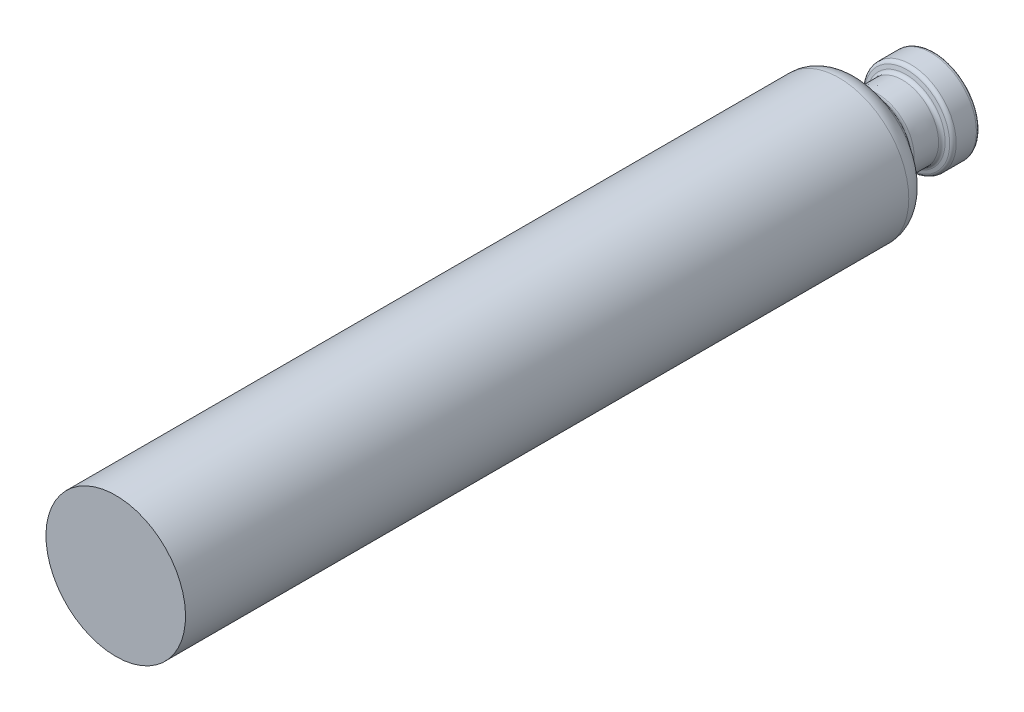
ISO-10303-21;
HEADER;
FILE_DESCRIPTION(('STEP AP214'),'2;1');
FILE_NAME('part.step','',(''),(''),'','','');
FILE_SCHEMA(('AUTOMOTIVE_DESIGN { 1 0 10303 214 1 1 1 1 }'));
ENDSEC;
DATA;
#1=APPLICATION_CONTEXT('core data for automotive mechanical design processes');
#2=APPLICATION_PROTOCOL_DEFINITION('international standard','automotive_design',2000,#1);
#3=PRODUCT_CONTEXT('',#1,'mechanical');
#4=PRODUCT('Part','Part','',(#3));
#5=PRODUCT_RELATED_PRODUCT_CATEGORY('part','',(#4));
#6=PRODUCT_DEFINITION_FORMATION('','',#4);
#7=PRODUCT_DEFINITION_CONTEXT('part definition',#1,'design');
#8=PRODUCT_DEFINITION('design','',#6,#7);
#9=PRODUCT_DEFINITION_SHAPE('','',#8);
#10=(LENGTH_UNIT() NAMED_UNIT(*) SI_UNIT(.MILLI.,.METRE.));
#11=(NAMED_UNIT(*) PLANE_ANGLE_UNIT() SI_UNIT($,.RADIAN.));
#12=(NAMED_UNIT(*) SI_UNIT($,.STERADIAN.) SOLID_ANGLE_UNIT());
#13=UNCERTAINTY_MEASURE_WITH_UNIT(LENGTH_MEASURE(1.E-05),#10,'distance_accuracy_value','');
#14=(GEOMETRIC_REPRESENTATION_CONTEXT(3) GLOBAL_UNCERTAINTY_ASSIGNED_CONTEXT((#13)) GLOBAL_UNIT_ASSIGNED_CONTEXT((#10,
#11,#12)) REPRESENTATION_CONTEXT('',''));
#15=CARTESIAN_POINT('',(0.,0.,0.));
#16=DIRECTION('',(0.,0.,1.));
#17=DIRECTION('',(1.,0.,0.));
#18=AXIS2_PLACEMENT_3D('',#15,#16,#17);
#19=CARTESIAN_POINT('',(0.,0.,0.492619400818587));
#20=DIRECTION('',(0.,0.,-1.));
#21=DIRECTION('',(0.,1.,0.));
#22=AXIS2_PLACEMENT_3D('',#19,#20,#21);
#23=CYLINDRICAL_SURFACE('',#22,1.775);
#24=CARTESIAN_POINT('',(0.,0.,0.485238801637173));
#25=DIRECTION('',(0.,0.,-1.));
#26=DIRECTION('',(1.,0.,0.));
#27=AXIS2_PLACEMENT_3D('',#24,#25,#26);
#28=CIRCLE('',#27,1.775);
#29=CARTESIAN_POINT('',(0.,-1.775,0.485238801637173));
#30=VERTEX_POINT('',#29);
#31=CARTESIAN_POINT('',(1.775,0.,0.485238801637173));
#32=VERTEX_POINT('',#31);
#33=EDGE_CURVE('E226',#30,#32,#28,.T.);
#34=ORIENTED_EDGE('',*,*,#33,.T.);
#35=CARTESIAN_POINT('',(0.,0.,0.485238801637173));
#36=DIRECTION('',(0.,0.,-1.));
#37=DIRECTION('',(1.,0.,0.));
#38=AXIS2_PLACEMENT_3D('',#35,#36,#37);
#39=CIRCLE('',#38,1.775);
#40=EDGE_CURVE('E296',#32,#30,#39,.T.);
#41=ORIENTED_EDGE('',*,*,#40,.T.);
#42=DIRECTION('',(0.,0.,1.));
#43=VECTOR('',#42,1.);
#44=CARTESIAN_POINT('',(0.,-1.775,0.492619400818587));
#45=LINE('',#44,#43);
#46=CARTESIAN_POINT('',(0.,-1.775,0.5));
#47=VERTEX_POINT('',#46);
#48=EDGE_CURVE('E11',#30,#47,#45,.T.);
#49=ORIENTED_EDGE('',*,*,#48,.T.);
#50=CARTESIAN_POINT('',(0.,0.,0.5));
#51=DIRECTION('',(0.,0.,-1.));
#52=DIRECTION('',(1.,0.,0.));
#53=AXIS2_PLACEMENT_3D('',#50,#51,#52);
#54=CIRCLE('',#53,1.775);
#55=EDGE_CURVE('E200',#47,#47,#54,.T.);
#56=ORIENTED_EDGE('',*,*,#55,.F.);
#57=ORIENTED_EDGE('',*,*,#48,.F.);
#58=EDGE_LOOP('',(#34,#41,#49,#56,#57));
#59=FACE_BOUND('',#58,.T.);
#60=ADVANCED_FACE('F19',(#59),#23,.F.);
#61=CARTESIAN_POINT('',(0.,0.,0.485238801637173));
#62=DIRECTION('',(0.,0.,-1.));
#63=DIRECTION('',(-1.,0.,0.));
#64=AXIS2_PLACEMENT_3D('',#61,#62,#63);
#65=TOROIDAL_SURFACE('',#64,2.175,0.4);
#66=ORIENTED_EDGE('',*,*,#33,.F.);
#67=ORIENTED_EDGE('',*,*,#40,.F.);
#68=CARTESIAN_POINT('',(2.175,0.,0.485238801637173));
#69=DIRECTION('',(0.,-1.,0.));
#70=DIRECTION('',(1.,0.,0.));
#71=AXIS2_PLACEMENT_3D('',#68,#69,#70);
#72=CIRCLE('',#71,0.4);
#73=CARTESIAN_POINT('',(2.25132359815062,0.,0.0925879282581075));
#74=VERTEX_POINT('',#73);
#75=EDGE_CURVE('E30',#32,#74,#72,.T.);
#76=ORIENTED_EDGE('',*,*,#75,.T.);
#77=CARTESIAN_POINT('',(0.,0.,0.0925879282581075));
#78=DIRECTION('',(0.,0.,-1.));
#79=DIRECTION('',(1.,0.,0.));
#80=AXIS2_PLACEMENT_3D('',#77,#78,#79);
#81=CIRCLE('',#80,2.25132359815062);
#82=CARTESIAN_POINT('',(0.,-2.25132359815062,0.0925879282581076));
#83=VERTEX_POINT('',#82);
#84=EDGE_CURVE('E222',#74,#83,#81,.T.);
#85=ORIENTED_EDGE('',*,*,#84,.T.);
#86=CARTESIAN_POINT('',(0.,0.,0.0925879282581075));
#87=DIRECTION('',(0.,0.,-1.));
#88=DIRECTION('',(1.,0.,0.));
#89=AXIS2_PLACEMENT_3D('',#86,#87,#88);
#90=CIRCLE('',#89,2.25132359815062);
#91=EDGE_CURVE('E223',#83,#74,#90,.T.);
#92=ORIENTED_EDGE('',*,*,#91,.T.);
#93=ORIENTED_EDGE('',*,*,#75,.F.);
#94=EDGE_LOOP('',(#66,#67,#76,#85,#92,#93));
#95=FACE_BOUND('',#94,.T.);
#96=ADVANCED_FACE('F327',(#95),#65,.T.);
#97=CARTESIAN_POINT('',(0.,0.,0.197642622708475));
#98=DIRECTION('',(0.,0.,1.));
#99=DIRECTION('',(0.,1.,0.));
#100=AXIS2_PLACEMENT_3D('',#97,#98,#99);
#101=CONICAL_SURFACE('',#100,2.79178314838179,1.37881010907552);
#102=ORIENTED_EDGE('',*,*,#91,.F.);
#103=DIRECTION('',(0.,-0.981627183447664,0.190808995376545));
#104=VECTOR('',#103,1.);
#105=CARTESIAN_POINT('',(0.,-2.79178314838179,0.197642622708475));
#106=LINE('',#105,#104);
#107=CARTESIAN_POINT('',(0.,-3.33224269861296,0.302697317158843));
#108=VERTEX_POINT('',#107);
#109=EDGE_CURVE('E219',#83,#108,#106,.T.);
#110=ORIENTED_EDGE('',*,*,#109,.T.);
#111=CARTESIAN_POINT('',(0.,0.,0.302697317158843));
#112=DIRECTION('',(0.,0.,-1.));
#113=DIRECTION('',(1.,0.,0.));
#114=AXIS2_PLACEMENT_3D('',#111,#112,#113);
#115=CIRCLE('',#114,3.33224269861296);
#116=CARTESIAN_POINT('',(3.33224269861296,0.,0.302697317158843));
#117=VERTEX_POINT('',#116);
#118=EDGE_CURVE('E246',#108,#117,#115,.T.);
#119=ORIENTED_EDGE('',*,*,#118,.T.);
#120=CARTESIAN_POINT('',(0.,0.,0.302697317158843));
#121=DIRECTION('',(0.,0.,-1.));
#122=DIRECTION('',(1.,0.,0.));
#123=AXIS2_PLACEMENT_3D('',#120,#121,#122);
#124=CIRCLE('',#123,3.33224269861296);
#125=EDGE_CURVE('E242',#117,#108,#124,.T.);
#126=ORIENTED_EDGE('',*,*,#125,.T.);
#127=ORIENTED_EDGE('',*,*,#109,.F.);
#128=ORIENTED_EDGE('',*,*,#84,.F.);
#129=EDGE_LOOP('',(#102,#110,#119,#126,#127,#128));
#130=FACE_BOUND('',#129,.T.);
#131=ADVANCED_FACE('F332',(#130),#101,.T.);
#132=CARTESIAN_POINT('',(0.,0.,0.597185472193142));
#133=DIRECTION('',(0.,0.,-1.));
#134=DIRECTION('',(-1.,0.,0.));
#135=AXIS2_PLACEMENT_3D('',#132,#133,#134);
#136=TOROIDAL_SURFACE('',#135,3.275,0.3);
#137=ORIENTED_EDGE('',*,*,#118,.F.);
#138=ORIENTED_EDGE('',*,*,#125,.F.);
#139=CARTESIAN_POINT('',(3.275,0.,0.597185472193142));
#140=DIRECTION('',(0.,-1.,0.));
#141=DIRECTION('',(1.,0.,0.));
#142=AXIS2_PLACEMENT_3D('',#139,#140,#141);
#143=CIRCLE('',#142,0.3);
#144=CARTESIAN_POINT('',(3.575,0.,0.597185472193142));
#145=VERTEX_POINT('',#144);
#146=EDGE_CURVE('E241',#117,#145,#143,.T.);
#147=ORIENTED_EDGE('',*,*,#146,.T.);
#148=CARTESIAN_POINT('',(0.,0.,0.597185472193142));
#149=DIRECTION('',(0.,0.,-1.));
#150=DIRECTION('',(1.,0.,0.));
#151=AXIS2_PLACEMENT_3D('',#148,#149,#150);
#152=CIRCLE('',#151,3.575);
#153=CARTESIAN_POINT('',(0.,-3.575,0.597185472193142));
#154=VERTEX_POINT('',#153);
#155=EDGE_CURVE('E290',#145,#154,#152,.T.);
#156=ORIENTED_EDGE('',*,*,#155,.T.);
#157=CARTESIAN_POINT('',(0.,0.,0.597185472193142));
#158=DIRECTION('',(0.,0.,-1.));
#159=DIRECTION('',(1.,0.,0.));
#160=AXIS2_PLACEMENT_3D('',#157,#158,#159);
#161=CIRCLE('',#160,3.575);
#162=EDGE_CURVE('E170',#154,#145,#161,.T.);
#163=ORIENTED_EDGE('',*,*,#162,.T.);
#164=ORIENTED_EDGE('',*,*,#146,.F.);
#165=EDGE_LOOP('',(#137,#138,#147,#156,#163,#164));
#166=FACE_BOUND('',#165,.T.);
#167=ADVANCED_FACE('F336',(#166),#136,.T.);
#168=CARTESIAN_POINT('',(0.,0.,1.39043596612367));
#169=DIRECTION('',(0.,0.,-1.));
#170=DIRECTION('',(0.,1.,0.));
#171=AXIS2_PLACEMENT_3D('',#168,#169,#170);
#172=CYLINDRICAL_SURFACE('',#171,3.575);
#173=ORIENTED_EDGE('',*,*,#162,.F.);
#174=DIRECTION('',(0.,0.,1.));
#175=VECTOR('',#174,1.);
#176=CARTESIAN_POINT('',(0.,-3.575,1.39043596612367));
#177=LINE('',#176,#175);
#178=CARTESIAN_POINT('',(0.,-3.575,2.18368646005421));
#179=VERTEX_POINT('',#178);
#180=EDGE_CURVE('E156',#154,#179,#177,.T.);
#181=ORIENTED_EDGE('',*,*,#180,.T.);
#182=CARTESIAN_POINT('',(0.,0.,2.18368646005421));
#183=DIRECTION('',(0.,0.,-1.));
#184=DIRECTION('',(1.,0.,0.));
#185=AXIS2_PLACEMENT_3D('',#182,#183,#184);
#186=CIRCLE('',#185,3.575);
#187=CARTESIAN_POINT('',(3.575,0.,2.18368646005421));
#188=VERTEX_POINT('',#187);
#189=EDGE_CURVE('E165',#179,#188,#186,.T.);
#190=ORIENTED_EDGE('',*,*,#189,.T.);
#191=CARTESIAN_POINT('',(0.,0.,2.18368646005421));
#192=DIRECTION('',(0.,0.,-1.));
#193=DIRECTION('',(1.,0.,0.));
#194=AXIS2_PLACEMENT_3D('',#191,#192,#193);
#195=CIRCLE('',#194,3.575);
#196=EDGE_CURVE('E171',#188,#179,#195,.T.);
#197=ORIENTED_EDGE('',*,*,#196,.T.);
#198=ORIENTED_EDGE('',*,*,#180,.F.);
#199=ORIENTED_EDGE('',*,*,#155,.F.);
#200=EDGE_LOOP('',(#173,#181,#190,#197,#198,#199));
#201=FACE_BOUND('',#200,.T.);
#202=ADVANCED_FACE('F175',(#201),#172,.T.);
#203=CARTESIAN_POINT('',(0.,0.,2.18368646005421));
#204=DIRECTION('',(0.,0.,-1.));
#205=DIRECTION('',(-1.,0.,0.));
#206=AXIS2_PLACEMENT_3D('',#203,#204,#205);
#207=TOROIDAL_SURFACE('',#206,3.275,0.3);
#208=ORIENTED_EDGE('',*,*,#189,.F.);
#209=ORIENTED_EDGE('',*,*,#196,.F.);
#210=CARTESIAN_POINT('',(3.275,0.,2.18368646005421));
#211=DIRECTION('',(0.,-1.,0.));
#212=DIRECTION('',(1.,0.,0.));
#213=AXIS2_PLACEMENT_3D('',#210,#211,#212);
#214=CIRCLE('',#213,0.3);
#215=CARTESIAN_POINT('',(3.35264571353076,0.,2.47346420794093));
#216=VERTEX_POINT('',#215);
#217=EDGE_CURVE('E163',#188,#216,#214,.T.);
#218=ORIENTED_EDGE('',*,*,#217,.T.);
#219=CARTESIAN_POINT('',(0.,0.,2.47346420794093));
#220=DIRECTION('',(0.,0.,-1.));
#221=DIRECTION('',(1.,0.,0.));
#222=AXIS2_PLACEMENT_3D('',#219,#220,#221);
#223=CIRCLE('',#222,3.35264571353076);
#224=CARTESIAN_POINT('',(0.,-3.35264571353076,2.47346420794093));
#225=VERTEX_POINT('',#224);
#226=EDGE_CURVE('E177',#216,#225,#223,.T.);
#227=ORIENTED_EDGE('',*,*,#226,.T.);
#228=CARTESIAN_POINT('',(0.,0.,2.47346420794093));
#229=DIRECTION('',(0.,0.,-1.));
#230=DIRECTION('',(1.,0.,0.));
#231=AXIS2_PLACEMENT_3D('',#228,#229,#230);
#232=CIRCLE('',#231,3.35264571353076);
#233=EDGE_CURVE('E167',#225,#216,#232,.T.);
#234=ORIENTED_EDGE('',*,*,#233,.T.);
#235=ORIENTED_EDGE('',*,*,#217,.F.);
#236=EDGE_LOOP('',(#208,#209,#218,#227,#234,#235));
#237=FACE_BOUND('',#236,.T.);
#238=ADVANCED_FACE('F21',(#237),#207,.T.);
#239=CARTESIAN_POINT('',(0.,0.,2.51106581691542));
#240=DIRECTION('',(0.,0.,-1.));
#241=DIRECTION('',(0.,1.,0.));
#242=AXIS2_PLACEMENT_3D('',#239,#240,#241);
#243=CONICAL_SURFACE('',#242,3.21231459839161,1.30899693899575);
#244=ORIENTED_EDGE('',*,*,#233,.F.);
#245=DIRECTION('',(0.,0.965925826289069,0.258819045102519));
#246=VECTOR('',#245,1.);
#247=CARTESIAN_POINT('',(0.,-3.21231459839161,2.51106581691542));
#248=LINE('',#247,#246);
#249=CARTESIAN_POINT('',(0.,-3.07198348325247,2.54866742588991));
#250=VERTEX_POINT('',#249);
#251=EDGE_CURVE('E183',#225,#250,#248,.T.);
#252=ORIENTED_EDGE('',*,*,#251,.T.);
#253=CARTESIAN_POINT('',(0.,0.,2.54866742588991));
#254=DIRECTION('',(0.,0.,-1.));
#255=DIRECTION('',(1.,0.,0.));
#256=AXIS2_PLACEMENT_3D('',#253,#254,#255);
#257=CIRCLE('',#256,3.07198348325247);
#258=CARTESIAN_POINT('',(3.07198348325247,0.,2.54866742588991));
#259=VERTEX_POINT('',#258);
#260=EDGE_CURVE('E231',#250,#259,#257,.T.);
#261=ORIENTED_EDGE('',*,*,#260,.T.);
#262=CARTESIAN_POINT('',(0.,0.,2.54866742588991));
#263=DIRECTION('',(0.,0.,-1.));
#264=DIRECTION('',(1.,0.,0.));
#265=AXIS2_PLACEMENT_3D('',#262,#263,#264);
#266=CIRCLE('',#265,3.07198348325247);
#267=EDGE_CURVE('E227',#259,#250,#266,.T.);
#268=ORIENTED_EDGE('',*,*,#267,.T.);
#269=ORIENTED_EDGE('',*,*,#251,.F.);
#270=ORIENTED_EDGE('',*,*,#226,.F.);
#271=EDGE_LOOP('',(#244,#252,#261,#268,#269,#270));
#272=FACE_BOUND('',#271,.T.);
#273=ADVANCED_FACE('F374',(#272),#243,.T.);
#274=CARTESIAN_POINT('',(0.,0.,2.83844517377663));
#275=DIRECTION('',(0.,0.,-1.));
#276=DIRECTION('',(-1.,0.,0.));
#277=AXIS2_PLACEMENT_3D('',#274,#275,#276);
#278=TOROIDAL_SURFACE('',#277,3.14962919678323,0.3);
#279=CARTESIAN_POINT('',(0.,0.,2.83849663779055));
#280=DIRECTION('',(0.,0.,-1.));
#281=DIRECTION('',(1.,0.,0.));
#282=AXIS2_PLACEMENT_3D('',#279,#280,#281);
#283=CIRCLE('',#282,2.84962920119747);
#284=CARTESIAN_POINT('',(0.,-2.84962920119747,2.83849663779055));
#285=VERTEX_POINT('',#284);
#286=CARTESIAN_POINT('',(2.84962920119747,0.,2.83849663779055));
#287=VERTEX_POINT('',#286);
#288=EDGE_CURVE('E23',#285,#287,#283,.T.);
#289=ORIENTED_EDGE('',*,*,#288,.T.);
#290=CARTESIAN_POINT('',(3.14962919678323,0.,2.83844517377663));
#291=DIRECTION('',(0.,-1.,0.));
#292=DIRECTION('',(1.,0.,0.));
#293=AXIS2_PLACEMENT_3D('',#290,#291,#292);
#294=CIRCLE('',#293,0.3);
#295=EDGE_CURVE('E196',#287,#259,#294,.T.);
#296=ORIENTED_EDGE('',*,*,#295,.T.);
#297=ORIENTED_EDGE('',*,*,#260,.F.);
#298=ORIENTED_EDGE('',*,*,#267,.F.);
#299=ORIENTED_EDGE('',*,*,#295,.F.);
#300=CARTESIAN_POINT('',(0.,0.,2.83849663779055));
#301=DIRECTION('',(0.,0.,-1.));
#302=DIRECTION('',(1.,0.,0.));
#303=AXIS2_PLACEMENT_3D('',#300,#301,#302);
#304=CIRCLE('',#303,2.84962920119747);
#305=EDGE_CURVE('E192',#287,#285,#304,.T.);
#306=ORIENTED_EDGE('',*,*,#305,.T.);
#307=EDGE_LOOP('',(#289,#296,#297,#298,#299,#306));
#308=FACE_BOUND('',#307,.T.);
#309=ADVANCED_FACE('F354',(#308),#278,.F.);
#310=CARTESIAN_POINT('',(0.,0.,3.79598862127023));
#311=DIRECTION('',(0.,0.,1.));
#312=DIRECTION('',(0.,1.,0.));
#313=AXIS2_PLACEMENT_3D('',#310,#311,#312);
#314=CONICAL_SURFACE('',#313,2.84979345580244,0.00017154671375515);
#315=ORIENTED_EDGE('',*,*,#288,.F.);
#316=DIRECTION('',(0.,-0.000171546713069514,0.999999985285863));
#317=VECTOR('',#316,1.);
#318=CARTESIAN_POINT('',(0.,-2.84979345580244,3.79598862127023));
#319=LINE('',#318,#317);
#320=CARTESIAN_POINT('',(0.,-2.84995771040741,4.7534806047499));
#321=VERTEX_POINT('',#320);
#322=EDGE_CURVE('E187',#285,#321,#319,.T.);
#323=ORIENTED_EDGE('',*,*,#322,.T.);
#324=CARTESIAN_POINT('',(0.,0.,4.7534806047499));
#325=DIRECTION('',(0.,0.,-1.));
#326=DIRECTION('',(1.,0.,0.));
#327=AXIS2_PLACEMENT_3D('',#324,#325,#326);
#328=CIRCLE('',#327,2.84995771040741);
#329=CARTESIAN_POINT('',(2.84995771040741,0.,4.7534806047499));
#330=VERTEX_POINT('',#329);
#331=EDGE_CURVE('E259',#321,#330,#328,.T.);
#332=ORIENTED_EDGE('',*,*,#331,.T.);
#333=CARTESIAN_POINT('',(0.,0.,4.7534806047499));
#334=DIRECTION('',(0.,0.,-1.));
#335=DIRECTION('',(1.,0.,0.));
#336=AXIS2_PLACEMENT_3D('',#333,#334,#335);
#337=CIRCLE('',#336,2.84995771040741);
#338=EDGE_CURVE('E256',#330,#321,#337,.T.);
#339=ORIENTED_EDGE('',*,*,#338,.T.);
#340=ORIENTED_EDGE('',*,*,#322,.F.);
#341=ORIENTED_EDGE('',*,*,#305,.F.);
#342=EDGE_LOOP('',(#315,#323,#332,#339,#340,#341));
#343=FACE_BOUND('',#342,.T.);
#344=ADVANCED_FACE('F360',(#343),#314,.T.);
#345=CARTESIAN_POINT('',(0.,0.,4.75339483139337));
#346=DIRECTION('',(0.,0.,-1.));
#347=DIRECTION('',(-1.,0.,0.));
#348=AXIS2_PLACEMENT_3D('',#345,#346,#347);
#349=TOROIDAL_SURFACE('',#348,3.34995770305035,0.5);
#350=CARTESIAN_POINT('',(0.,0.,5.15007150153899));
#351=DIRECTION('',(0.,0.,-1.));
#352=DIRECTION('',(1.,0.,0.));
#353=AXIS2_PLACEMENT_3D('',#350,#351,#352);
#354=CIRCLE('',#353,3.04557698854599);
#355=CARTESIAN_POINT('',(0.,-3.04557698854599,5.15007150153899));
#356=VERTEX_POINT('',#355);
#357=CARTESIAN_POINT('',(3.04557698854599,0.,5.15007150153899));
#358=VERTEX_POINT('',#357);
#359=EDGE_CURVE('E254',#356,#358,#354,.T.);
#360=ORIENTED_EDGE('',*,*,#359,.T.);
#361=CARTESIAN_POINT('',(3.34995770305035,0.,4.75339483139337));
#362=DIRECTION('',(0.,-1.,0.));
#363=DIRECTION('',(1.,0.,0.));
#364=AXIS2_PLACEMENT_3D('',#361,#362,#363);
#365=CIRCLE('',#364,0.5);
#366=EDGE_CURVE('E235',#358,#330,#365,.T.);
#367=ORIENTED_EDGE('',*,*,#366,.T.);
#368=ORIENTED_EDGE('',*,*,#331,.F.);
#369=ORIENTED_EDGE('',*,*,#338,.F.);
#370=ORIENTED_EDGE('',*,*,#366,.F.);
#371=CARTESIAN_POINT('',(0.,0.,5.15007150153899));
#372=DIRECTION('',(0.,0.,-1.));
#373=DIRECTION('',(1.,0.,0.));
#374=AXIS2_PLACEMENT_3D('',#371,#372,#373);
#375=CIRCLE('',#374,3.04557698854599);
#376=EDGE_CURVE('E232',#358,#356,#375,.T.);
#377=ORIENTED_EDGE('',*,*,#376,.T.);
#378=EDGE_LOOP('',(#360,#367,#368,#369,#370,#377));
#379=FACE_BOUND('',#378,.T.);
#380=ADVANCED_FACE('F363',(#379),#349,.F.);
#381=CARTESIAN_POINT('',(0.,0.,5.84198609108393));
#382=DIRECTION('',(0.,0.,1.));
#383=DIRECTION('',(0.,1.,0.));
#384=AXIS2_PLACEMENT_3D('',#381,#382,#383);
#385=CONICAL_SURFACE('',#384,3.94729763747997,0.916297857297023);
#386=ORIENTED_EDGE('',*,*,#359,.F.);
#387=DIRECTION('',(0.,-0.793353340291235,0.608761429008721));
#388=VECTOR('',#387,1.);
#389=CARTESIAN_POINT('',(0.,-3.94729763747997,5.84198609108393));
#390=LINE('',#389,#388);
#391=CARTESIAN_POINT('',(0.,-4.84901828641395,6.53390068062888));
#392=VERTEX_POINT('',#391);
#393=EDGE_CURVE('E217',#356,#392,#390,.T.);
#394=ORIENTED_EDGE('',*,*,#393,.T.);
#395=CARTESIAN_POINT('',(0.,0.,6.53390068062888));
#396=DIRECTION('',(0.,0.,-1.));
#397=DIRECTION('',(1.,0.,0.));
#398=AXIS2_PLACEMENT_3D('',#395,#396,#397);
#399=CIRCLE('',#398,4.84901828641395);
#400=CARTESIAN_POINT('',(4.84901828641395,0.,6.53390068062888));
#401=VERTEX_POINT('',#400);
#402=EDGE_CURVE('E268',#392,#401,#399,.T.);
#403=ORIENTED_EDGE('',*,*,#402,.T.);
#404=CARTESIAN_POINT('',(0.,0.,6.53390068062888));
#405=DIRECTION('',(0.,0.,-1.));
#406=DIRECTION('',(1.,0.,0.));
#407=AXIS2_PLACEMENT_3D('',#404,#405,#406);
#408=CIRCLE('',#407,4.84901828641395);
#409=EDGE_CURVE('E255',#401,#392,#408,.T.);
#410=ORIENTED_EDGE('',*,*,#409,.T.);
#411=ORIENTED_EDGE('',*,*,#393,.F.);
#412=ORIENTED_EDGE('',*,*,#376,.F.);
#413=EDGE_LOOP('',(#386,#394,#403,#410,#411,#412));
#414=FACE_BOUND('',#413,.T.);
#415=ADVANCED_FACE('F372',(#414),#385,.T.);
#416=CARTESIAN_POINT('',(0.,0.,7.80326602509486));
#417=DIRECTION('',(0.,0.,-1.));
#418=DIRECTION('',(-1.,0.,0.));
#419=AXIS2_PLACEMENT_3D('',#416,#417,#418);
#420=TOROIDAL_SURFACE('',#419,3.875,1.6);
#421=ORIENTED_EDGE('',*,*,#402,.F.);
#422=ORIENTED_EDGE('',*,*,#409,.F.);
#423=CARTESIAN_POINT('',(3.875,0.,7.80326602509486));
#424=DIRECTION('',(0.,-1.,0.));
#425=DIRECTION('',(1.,0.,0.));
#426=AXIS2_PLACEMENT_3D('',#423,#424,#425);
#427=CIRCLE('',#426,1.6);
#428=CARTESIAN_POINT('',(5.475,0.,7.80326602509486));
#429=VERTEX_POINT('',#428);
#430=EDGE_CURVE('E251',#401,#429,#427,.T.);
#431=ORIENTED_EDGE('',*,*,#430,.T.);
#432=CARTESIAN_POINT('',(0.,0.,7.80326602509486));
#433=DIRECTION('',(0.,0.,-1.));
#434=DIRECTION('',(1.,0.,0.));
#435=AXIS2_PLACEMENT_3D('',#432,#433,#434);
#436=CIRCLE('',#435,5.475);
#437=CARTESIAN_POINT('',(0.,-5.475,7.80326602509486));
#438=VERTEX_POINT('',#437);
#439=EDGE_CURVE('E266',#429,#438,#436,.T.);
#440=ORIENTED_EDGE('',*,*,#439,.T.);
#441=CARTESIAN_POINT('',(0.,0.,7.80326602509486));
#442=DIRECTION('',(0.,0.,-1.));
#443=DIRECTION('',(1.,0.,0.));
#444=AXIS2_PLACEMENT_3D('',#441,#442,#443);
#445=CIRCLE('',#444,5.475);
#446=EDGE_CURVE('E199',#438,#429,#445,.T.);
#447=ORIENTED_EDGE('',*,*,#446,.T.);
#448=ORIENTED_EDGE('',*,*,#430,.F.);
#449=EDGE_LOOP('',(#421,#422,#431,#440,#447,#448));
#450=FACE_BOUND('',#449,.T.);
#451=ADVANCED_FACE('F379',(#450),#420,.T.);
#452=CARTESIAN_POINT('',(0.,0.,36.1766330125474));
#453=DIRECTION('',(0.,0.,-1.));
#454=DIRECTION('',(0.,1.,0.));
#455=AXIS2_PLACEMENT_3D('',#452,#453,#454);
#456=CYLINDRICAL_SURFACE('',#455,5.475);
#457=ORIENTED_EDGE('',*,*,#446,.F.);
#458=DIRECTION('',(0.,0.,1.));
#459=VECTOR('',#458,1.);
#460=CARTESIAN_POINT('',(0.,-5.475,36.1766330125474));
#461=LINE('',#460,#459);
#462=CARTESIAN_POINT('',(0.,-5.475,64.55));
#463=VERTEX_POINT('',#462);
#464=EDGE_CURVE('E250',#438,#463,#461,.T.);
#465=ORIENTED_EDGE('',*,*,#464,.T.);
#466=CARTESIAN_POINT('',(0.,0.,64.55));
#467=DIRECTION('',(0.,0.,-1.));
#468=DIRECTION('',(1.,0.,0.));
#469=AXIS2_PLACEMENT_3D('',#466,#467,#468);
#470=CIRCLE('',#469,5.475);
#471=EDGE_CURVE('E190',#463,#463,#470,.T.);
#472=ORIENTED_EDGE('',*,*,#471,.T.);
#473=ORIENTED_EDGE('',*,*,#464,.F.);
#474=ORIENTED_EDGE('',*,*,#439,.F.);
#475=EDGE_LOOP('',(#457,#465,#472,#473,#474));
#476=FACE_BOUND('',#475,.T.);
#477=ADVANCED_FACE('F368',(#476),#456,.T.);
#478=CARTESIAN_POINT('',(0.,5.475,64.55));
#479=DIRECTION('',(0.,0.,1.));
#480=DIRECTION('',(1.,0.,0.));
#481=AXIS2_PLACEMENT_3D('',#478,#479,#480);
#482=PLANE('',#481);
#483=ORIENTED_EDGE('',*,*,#471,.F.);
#484=EDGE_LOOP('',(#483));
#485=FACE_BOUND('',#484,.T.);
#486=ADVANCED_FACE('F365',(#485),#482,.T.);
#487=CARTESIAN_POINT('',(0.,0.,0.));
#488=DIRECTION('',(0.,0.,-1.));
#489=DIRECTION('',(0.,-1.,0.));
#490=AXIS2_PLACEMENT_3D('',#487,#488,#489);
#491=PLANE('',#490);
#492=CARTESIAN_POINT('',(0.,0.,0.));
#493=DIRECTION('',(0.,0.,-1.));
#494=DIRECTION('',(1.,0.,0.));
#495=AXIS2_PLACEMENT_3D('',#492,#493,#494);
#496=CIRCLE('',#495,0.775);
#497=CARTESIAN_POINT('',(0.,-0.775,0.));
#498=VERTEX_POINT('',#497);
#499=EDGE_CURVE('E191',#498,#498,#496,.T.);
#500=ORIENTED_EDGE('',*,*,#499,.T.);
#501=EDGE_LOOP('',(#500));
#502=FACE_BOUND('',#501,.T.);
#503=ADVANCED_FACE('F359',(#502),#491,.T.);
#504=CARTESIAN_POINT('',(0.,0.,0.25));
#505=DIRECTION('',(0.,0.,-1.));
#506=DIRECTION('',(0.,1.,0.));
#507=AXIS2_PLACEMENT_3D('',#504,#505,#506);
#508=CYLINDRICAL_SURFACE('',#507,0.775);
#509=ORIENTED_EDGE('',*,*,#499,.F.);
#510=DIRECTION('',(0.,0.,1.));
#511=VECTOR('',#510,1.);
#512=CARTESIAN_POINT('',(0.,-0.775,0.25));
#513=LINE('',#512,#511);
#514=CARTESIAN_POINT('',(0.,-0.775,0.5));
#515=VERTEX_POINT('',#514);
#516=EDGE_CURVE('E107',#498,#515,#513,.T.);
#517=ORIENTED_EDGE('',*,*,#516,.T.);
#518=CARTESIAN_POINT('',(0.,0.,0.5));
#519=DIRECTION('',(0.,0.,-1.));
#520=DIRECTION('',(1.,0.,0.));
#521=AXIS2_PLACEMENT_3D('',#518,#519,#520);
#522=CIRCLE('',#521,0.775);
#523=EDGE_CURVE('E203',#515,#515,#522,.T.);
#524=ORIENTED_EDGE('',*,*,#523,.T.);
#525=ORIENTED_EDGE('',*,*,#516,.F.);
#526=EDGE_LOOP('',(#509,#517,#524,#525));
#527=FACE_BOUND('',#526,.T.);
#528=ADVANCED_FACE('F355',(#527),#508,.T.);
#529=CARTESIAN_POINT('',(0.,0.775,0.5));
#530=DIRECTION('',(0.,0.,-1.));
#531=DIRECTION('',(0.,-1.,0.));
#532=AXIS2_PLACEMENT_3D('',#529,#530,#531);
#533=PLANE('',#532);
#534=ORIENTED_EDGE('',*,*,#523,.F.);
#535=EDGE_LOOP('',(#534));
#536=FACE_BOUND('',#535,.T.);
#537=ORIENTED_EDGE('',*,*,#55,.T.);
#538=EDGE_LOOP('',(#537));
#539=FACE_BOUND('',#538,.T.);
#540=ADVANCED_FACE('F358',(#536,#539),#533,.T.);
#541=CLOSED_SHELL('',(#60,#96,#131,#167,#202,#238,#273,#309,#344,#380,#415,#451,#477,#486,#503,
#528,#540));
#542=MANIFOLD_SOLID_BREP('B1',#541);
#543=ADVANCED_BREP_SHAPE_REPRESENTATION('',(#18,#542),#14);
#544=SHAPE_DEFINITION_REPRESENTATION(#9,#543);
ENDSEC;
END-ISO-10303-21;
